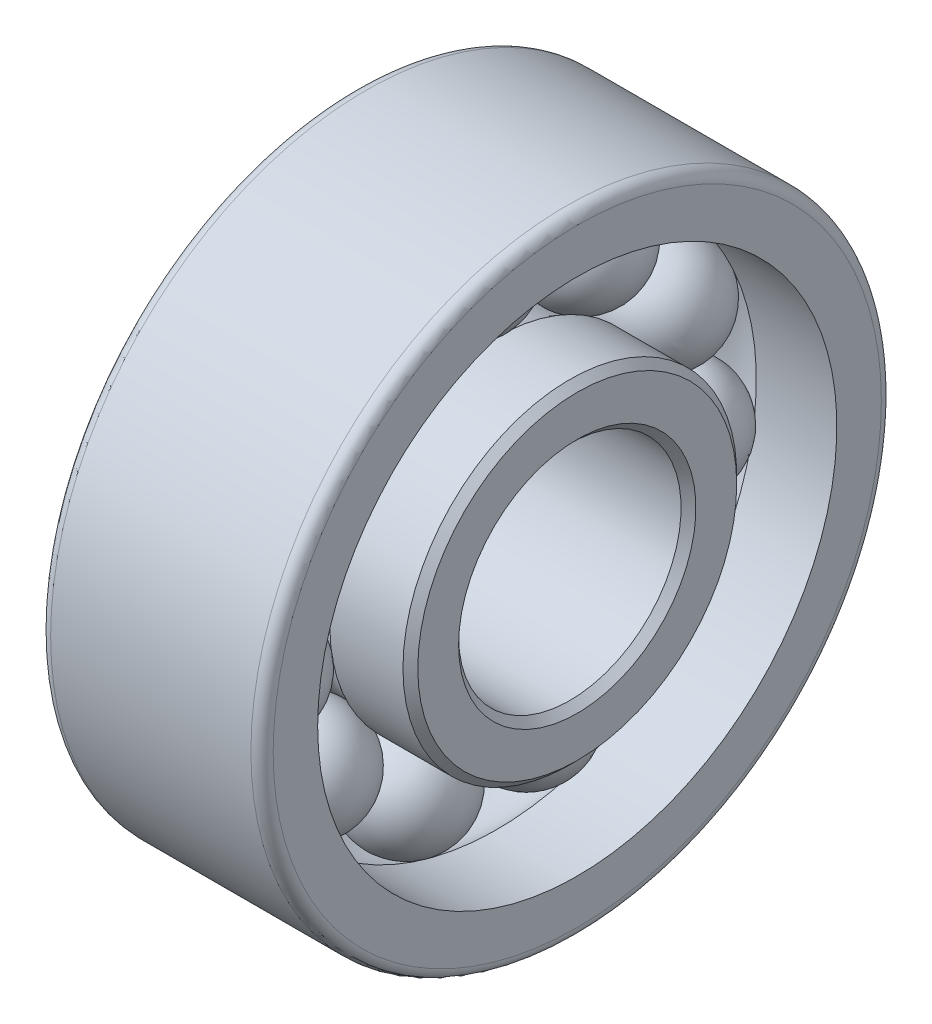
ISO-10303-21;
HEADER;
FILE_DESCRIPTION(('STEP AP214'),'2;1');
FILE_NAME('part.step','',(''),(''),'','','');
FILE_SCHEMA(('AUTOMOTIVE_DESIGN { 1 0 10303 214 1 1 1 1 }'));
ENDSEC;
DATA;
#1=APPLICATION_CONTEXT('core data for automotive mechanical design processes');
#2=APPLICATION_PROTOCOL_DEFINITION('international standard','automotive_design',2000,#1);
#3=PRODUCT_CONTEXT('',#1,'mechanical');
#4=PRODUCT('Part','Part','',(#3));
#5=PRODUCT_RELATED_PRODUCT_CATEGORY('part','',(#4));
#6=PRODUCT_DEFINITION_FORMATION('','',#4);
#7=PRODUCT_DEFINITION_CONTEXT('part definition',#1,'design');
#8=PRODUCT_DEFINITION('design','',#6,#7);
#9=PRODUCT_DEFINITION_SHAPE('','',#8);
#10=(LENGTH_UNIT() NAMED_UNIT(*) SI_UNIT(.MILLI.,.METRE.));
#11=(NAMED_UNIT(*) PLANE_ANGLE_UNIT() SI_UNIT($,.RADIAN.));
#12=(NAMED_UNIT(*) SI_UNIT($,.STERADIAN.) SOLID_ANGLE_UNIT());
#13=UNCERTAINTY_MEASURE_WITH_UNIT(LENGTH_MEASURE(1.E-05),#10,'distance_accuracy_value','');
#14=(GEOMETRIC_REPRESENTATION_CONTEXT(3) GLOBAL_UNCERTAINTY_ASSIGNED_CONTEXT((#13)) GLOBAL_UNIT_ASSIGNED_CONTEXT((#10,
#11,#12)) REPRESENTATION_CONTEXT('',''));
#15=CARTESIAN_POINT('',(0.,0.,0.));
#16=DIRECTION('',(0.,0.,1.));
#17=DIRECTION('',(1.,0.,0.));
#18=AXIS2_PLACEMENT_3D('',#15,#16,#17);
#19=CARTESIAN_POINT('',(3.,1.83720781377933,3.10868470036962));
#20=DIRECTION('',(0.,0.841253532831188,0.540640817455586));
#21=DIRECTION('',(1.,0.,0.));
#22=AXIS2_PLACEMENT_3D('',#19,#20,#21);
#23=SPHERICAL_SURFACE('',#22,1.5);
#24=CARTESIAN_POINT('',(3.,3.09908811302612,3.919645926553));
#25=VERTEX_POINT('',#24);
#26=VERTEX_LOOP('',#25);
#27=FACE_BOUND('',#26,.T.);
#28=ADVANCED_FACE('F48',(#27),#23,.T.);
#29=CLOSED_SHELL('',(#28));
#30=MANIFOLD_SOLID_BREP('B2',#29);
#31=CARTESIAN_POINT('',(3.,-0.611363675239089,5.23038397328845));
#32=DIRECTION('',(0.,0.415415013001897,0.909631995354513));
#33=DIRECTION('',(1.,0.,0.));
#34=AXIS2_PLACEMENT_3D('',#31,#32,#33);
#35=SPHERICAL_SURFACE('',#34,1.5);
#36=CARTESIAN_POINT('',(3.,0.0117588442637567,6.59483196632022));
#37=VERTEX_POINT('',#36);
#38=VERTEX_LOOP('',#37);
#39=FACE_BOUND('',#38,.T.);
#40=ADVANCED_FACE('F71',(#39),#35,.T.);
#41=CLOSED_SHELL('',(#40));
#42=MANIFOLD_SOLID_BREP('B6',#41);
#43=CARTESIAN_POINT('',(3.,-3.81831032007133,5.69147329081537));
#44=DIRECTION('',(0.,-0.142314838273275,0.989821441880934));
#45=DIRECTION('',(1.,0.,0.));
#46=AXIS2_PLACEMENT_3D('',#43,#44,#45);
#47=SPHERICAL_SURFACE('',#46,1.5);
#48=CARTESIAN_POINT('',(3.,-4.03178257748124,7.17620545363678));
#49=VERTEX_POINT('',#48);
#50=VERTEX_LOOP('',#49);
#51=FACE_BOUND('',#50,.T.);
#52=ADVANCED_FACE('F94',(#51),#47,.T.);
#53=CLOSED_SHELL('',(#52));
#54=MANIFOLD_SOLID_BREP('B44',#53);
#55=CARTESIAN_POINT('',(3.,-6.76544922018535,4.34556005253702));
#56=DIRECTION('',(0.,-0.654860733945278,0.755749574354264));
#57=DIRECTION('',(1.,0.,0.));
#58=AXIS2_PLACEMENT_3D('',#55,#56,#57);
#59=SPHERICAL_SURFACE('',#58,1.5);
#60=CARTESIAN_POINT('',(3.,-7.74774032110327,5.47918441406842));
#61=VERTEX_POINT('',#60);
#62=VERTEX_LOOP('',#61);
#63=FACE_BOUND('',#62,.T.);
#64=ADVANCED_FACE('F117',(#63),#59,.T.);
#65=CLOSED_SHELL('',(#64));
#66=MANIFOLD_SOLID_BREP('B67',#65);
#67=CARTESIAN_POINT('',(3.,-8.51708459828335,1.61996220183826));
#68=DIRECTION('',(0.,-0.959492973614495,0.281732556841437));
#69=DIRECTION('',(1.,0.,0.));
#70=AXIS2_PLACEMENT_3D('',#67,#68,#69);
#71=SPHERICAL_SURFACE('',#70,1.5);
#72=CARTESIAN_POINT('',(3.,-9.95632405870509,2.04256103710042));
#73=VERTEX_POINT('',#72);
#74=VERTEX_LOOP('',#73);
#75=FACE_BOUND('',#74,.T.);
#76=ADVANCED_FACE('F140',(#75),#71,.T.);
#77=CLOSED_SHELL('',(#76));
#78=MANIFOLD_SOLID_BREP('B90',#77);
#79=CARTESIAN_POINT('',(3.,-8.51708459828337,-1.61996220183818));
#80=DIRECTION('',(0.,-0.959492973614499,-0.281732556841423));
#81=DIRECTION('',(1.,0.,0.));
#82=AXIS2_PLACEMENT_3D('',#79,#80,#81);
#83=SPHERICAL_SURFACE('',#82,1.5);
#84=CARTESIAN_POINT('',(3.,-9.95632405870512,-2.04256103710032));
#85=VERTEX_POINT('',#84);
#86=VERTEX_LOOP('',#85);
#87=FACE_BOUND('',#86,.T.);
#88=ADVANCED_FACE('F163',(#87),#83,.T.);
#89=CLOSED_SHELL('',(#88));
#90=MANIFOLD_SOLID_BREP('B113',#89);
#91=CARTESIAN_POINT('',(3.,-6.76544922018541,-4.34556005253697));
#92=DIRECTION('',(0.,-0.654860733945289,-0.755749574354255));
#93=DIRECTION('',(1.,0.,0.));
#94=AXIS2_PLACEMENT_3D('',#91,#92,#93);
#95=SPHERICAL_SURFACE('',#94,1.5);
#96=CARTESIAN_POINT('',(3.,-7.74774032110335,-5.47918441406835));
#97=VERTEX_POINT('',#96);
#98=VERTEX_LOOP('',#97);
#99=FACE_BOUND('',#98,.T.);
#100=ADVANCED_FACE('F186',(#99),#95,.T.);
#101=CLOSED_SHELL('',(#100));
#102=MANIFOLD_SOLID_BREP('B136',#101);
#103=CARTESIAN_POINT('',(3.,-3.81831032007141,-5.69147329081536));
#104=DIRECTION('',(0.,-0.142314838273289,-0.989821441880932));
#105=DIRECTION('',(1.,0.,0.));
#106=AXIS2_PLACEMENT_3D('',#103,#104,#105);
#107=SPHERICAL_SURFACE('',#106,1.5);
#108=CARTESIAN_POINT('',(3.,-4.03178257748135,-7.17620545363676));
#109=VERTEX_POINT('',#108);
#110=VERTEX_LOOP('',#109);
#111=FACE_BOUND('',#110,.T.);
#112=ADVANCED_FACE('F209',(#111),#107,.T.);
#113=CLOSED_SHELL('',(#112));
#114=MANIFOLD_SOLID_BREP('B159',#113);
#115=CARTESIAN_POINT('',(3.,-0.611363675239166,-5.23038397328849));
#116=DIRECTION('',(0.,0.415415013001884,-0.909631995354519));
#117=DIRECTION('',(1.,0.,0.));
#118=AXIS2_PLACEMENT_3D('',#115,#116,#117);
#119=SPHERICAL_SURFACE('',#118,1.5);
#120=CARTESIAN_POINT('',(3.,0.0117588442636605,-6.59483196632027));
#121=VERTEX_POINT('',#120);
#122=VERTEX_LOOP('',#121);
#123=FACE_BOUND('',#122,.T.);
#124=ADVANCED_FACE('F232',(#123),#119,.T.);
#125=CLOSED_SHELL('',(#124));
#126=MANIFOLD_SOLID_BREP('B182',#125);
#127=CARTESIAN_POINT('',(3.,1.83720781377929,-3.10868470036969));
#128=DIRECTION('',(0.,0.841253532831181,-0.540640817455599));
#129=DIRECTION('',(1.,0.,0.));
#130=AXIS2_PLACEMENT_3D('',#127,#128,#129);
#131=SPHERICAL_SURFACE('',#130,1.5);
#132=CARTESIAN_POINT('',(3.,3.09908811302606,-3.91964592655309));
#133=VERTEX_POINT('',#132);
#134=VERTEX_LOOP('',#133);
#135=FACE_BOUND('',#134,.T.);
#136=ADVANCED_FACE('F255',(#135),#131,.T.);
#137=CLOSED_SHELL('',(#136));
#138=MANIFOLD_SOLID_BREP('B205',#137);
#139=CARTESIAN_POINT('',(3.,2.75,0.));
#140=DIRECTION('',(0.,1.,0.));
#141=DIRECTION('',(1.,0.,0.));
#142=AXIS2_PLACEMENT_3D('',#139,#140,#141);
#143=SPHERICAL_SURFACE('',#142,1.5);
#144=CARTESIAN_POINT('',(3.,4.25,0.));
#145=VERTEX_POINT('',#144);
#146=VERTEX_LOOP('',#145);
#147=FACE_BOUND('',#146,.T.);
#148=ADVANCED_FACE('F280',(#147),#143,.T.);
#149=CLOSED_SHELL('',(#148));
#150=MANIFOLD_SOLID_BREP('B228',#149);
#151=CARTESIAN_POINT('',(0.,4.,0.));
#152=DIRECTION('',(1.,0.,0.));
#153=DIRECTION('',(0.,0.,-1.));
#154=AXIS2_PLACEMENT_3D('',#151,#152,#153);
#155=PLANE('',#154);
#156=CARTESIAN_POINT('',(0.,-3.,0.));
#157=DIRECTION('',(1.,0.,0.));
#158=DIRECTION('',(0.,0.,-1.));
#159=AXIS2_PLACEMENT_3D('',#156,#157,#158);
#160=CIRCLE('',#159,8.2);
#161=CARTESIAN_POINT('',(0.,-3.,-8.2));
#162=VERTEX_POINT('',#161);
#163=EDGE_CURVE('E279',#162,#162,#160,.F.);
#164=ORIENTED_EDGE('',*,*,#163,.T.);
#165=EDGE_LOOP('',(#164));
#166=FACE_BOUND('',#165,.T.);
#167=CARTESIAN_POINT('',(0.,-3.,0.));
#168=DIRECTION('',(-1.,0.,0.));
#169=DIRECTION('',(0.,0.,1.));
#170=AXIS2_PLACEMENT_3D('',#167,#168,#169);
#171=CIRCLE('',#170,7.);
#172=CARTESIAN_POINT('',(0.,-3.,7.));
#173=VERTEX_POINT('',#172);
#174=EDGE_CURVE('E322',#173,#173,#171,.T.);
#175=ORIENTED_EDGE('',*,*,#174,.F.);
#176=EDGE_LOOP('',(#175));
#177=FACE_BOUND('',#176,.T.);
#178=ADVANCED_FACE('F302',(#166,#177),#155,.F.);
#179=CARTESIAN_POINT('',(-1.0669014084507,-3.,0.));
#180=DIRECTION('',(-1.,0.,0.));
#181=DIRECTION('',(0.,0.,1.));
#182=AXIS2_PLACEMENT_3D('',#179,#180,#181);
#183=CYLINDRICAL_SURFACE('',#182,7.);
#184=CARTESIAN_POINT('',(2.17084380241115,-3.,0.));
#185=DIRECTION('',(-1.,0.,0.));
#186=DIRECTION('',(0.,0.,1.));
#187=AXIS2_PLACEMENT_3D('',#184,#185,#186);
#188=CIRCLE('',#187,7.);
#189=CARTESIAN_POINT('',(2.17084380241115,-3.,7.));
#190=VERTEX_POINT('',#189);
#191=EDGE_CURVE('E325',#190,#190,#188,.T.);
#192=ORIENTED_EDGE('',*,*,#191,.F.);
#193=EDGE_LOOP('',(#192));
#194=FACE_BOUND('',#193,.T.);
#195=ORIENTED_EDGE('',*,*,#174,.T.);
#196=EDGE_LOOP('',(#195));
#197=FACE_BOUND('',#196,.T.);
#198=ADVANCED_FACE('F346',(#194,#197),#183,.F.);
#199=CARTESIAN_POINT('',(3.,-3.,0.));
#200=DIRECTION('',(-1.,0.,0.));
#201=DIRECTION('',(0.,0.,1.));
#202=AXIS2_PLACEMENT_3D('',#199,#200,#201);
#203=TOROIDAL_SURFACE('',#202,5.75,1.5);
#204=CARTESIAN_POINT('',(3.82915619758885,-3.,0.));
#205=DIRECTION('',(-1.,0.,0.));
#206=DIRECTION('',(0.,0.,1.));
#207=AXIS2_PLACEMENT_3D('',#204,#205,#206);
#208=CIRCLE('',#207,7.);
#209=CARTESIAN_POINT('',(3.82915619758885,-3.,7.));
#210=VERTEX_POINT('',#209);
#211=EDGE_CURVE('E328',#210,#210,#208,.T.);
#212=ORIENTED_EDGE('',*,*,#211,.F.);
#213=EDGE_LOOP('',(#212));
#214=FACE_BOUND('',#213,.T.);
#215=ORIENTED_EDGE('',*,*,#191,.T.);
#216=EDGE_LOOP('',(#215));
#217=FACE_BOUND('',#216,.T.);
#218=ADVANCED_FACE('F340',(#214,#217),#203,.F.);
#219=CARTESIAN_POINT('',(-1.0669014084507,-3.,0.));
#220=DIRECTION('',(-1.,0.,0.));
#221=DIRECTION('',(0.,0.,1.));
#222=AXIS2_PLACEMENT_3D('',#219,#220,#221);
#223=CYLINDRICAL_SURFACE('',#222,7.);
#224=CARTESIAN_POINT('',(6.,-3.,0.));
#225=DIRECTION('',(-1.,0.,0.));
#226=DIRECTION('',(0.,0.,1.));
#227=AXIS2_PLACEMENT_3D('',#224,#225,#226);
#228=CIRCLE('',#227,7.);
#229=CARTESIAN_POINT('',(6.,-3.,7.));
#230=VERTEX_POINT('',#229);
#231=EDGE_CURVE('E331',#230,#230,#228,.T.);
#232=ORIENTED_EDGE('',*,*,#231,.F.);
#233=EDGE_LOOP('',(#232));
#234=FACE_BOUND('',#233,.T.);
#235=ORIENTED_EDGE('',*,*,#211,.T.);
#236=EDGE_LOOP('',(#235));
#237=FACE_BOUND('',#236,.T.);
#238=ADVANCED_FACE('F337',(#234,#237),#223,.F.);
#239=CARTESIAN_POINT('',(6.,4.,0.));
#240=DIRECTION('',(-1.,0.,0.));
#241=DIRECTION('',(0.,0.,1.));
#242=AXIS2_PLACEMENT_3D('',#239,#240,#241);
#243=PLANE('',#242);
#244=CARTESIAN_POINT('',(6.,-3.,0.));
#245=DIRECTION('',(-1.,0.,0.));
#246=DIRECTION('',(0.,0.,1.));
#247=AXIS2_PLACEMENT_3D('',#244,#245,#246);
#248=CIRCLE('',#247,8.2);
#249=CARTESIAN_POINT('',(6.,-3.,8.2));
#250=VERTEX_POINT('',#249);
#251=EDGE_CURVE('E309',#250,#250,#248,.F.);
#252=ORIENTED_EDGE('',*,*,#251,.T.);
#253=EDGE_LOOP('',(#252));
#254=FACE_BOUND('',#253,.T.);
#255=ORIENTED_EDGE('',*,*,#231,.T.);
#256=EDGE_LOOP('',(#255));
#257=FACE_BOUND('',#256,.T.);
#258=ADVANCED_FACE('F335',(#254,#257),#243,.F.);
#259=CARTESIAN_POINT('',(-1.0669014084507,-3.,0.));
#260=DIRECTION('',(-1.,0.,0.));
#261=DIRECTION('',(0.,0.,1.));
#262=AXIS2_PLACEMENT_3D('',#259,#260,#261);
#263=CYLINDRICAL_SURFACE('',#262,8.5);
#264=CARTESIAN_POINT('',(5.7,-3.,0.));
#265=DIRECTION('',(-1.,0.,0.));
#266=DIRECTION('',(0.,0.,1.));
#267=AXIS2_PLACEMENT_3D('',#264,#265,#266);
#268=CIRCLE('',#267,8.5);
#269=CARTESIAN_POINT('',(5.7,-3.,8.5));
#270=VERTEX_POINT('',#269);
#271=EDGE_CURVE('E313',#270,#270,#268,.T.);
#272=ORIENTED_EDGE('',*,*,#271,.T.);
#273=EDGE_LOOP('',(#272));
#274=FACE_BOUND('',#273,.T.);
#275=CARTESIAN_POINT('',(0.3,-3.,0.));
#276=DIRECTION('',(1.,0.,0.));
#277=DIRECTION('',(0.,0.,-1.));
#278=AXIS2_PLACEMENT_3D('',#275,#276,#277);
#279=CIRCLE('',#278,8.5);
#280=CARTESIAN_POINT('',(0.3,-3.,-8.5));
#281=VERTEX_POINT('',#280);
#282=EDGE_CURVE('E317',#281,#281,#279,.T.);
#283=ORIENTED_EDGE('',*,*,#282,.T.);
#284=EDGE_LOOP('',(#283));
#285=FACE_BOUND('',#284,.T.);
#286=ADVANCED_FACE('F361',(#274,#285),#263,.T.);
#287=CARTESIAN_POINT('',(5.7,-3.,0.));
#288=DIRECTION('',(-1.,0.,0.));
#289=DIRECTION('',(0.,0.,1.));
#290=AXIS2_PLACEMENT_3D('',#287,#288,#289);
#291=TOROIDAL_SURFACE('',#290,8.2,0.3);
#292=ORIENTED_EDGE('',*,*,#251,.F.);
#293=EDGE_LOOP('',(#292));
#294=FACE_BOUND('',#293,.T.);
#295=ORIENTED_EDGE('',*,*,#271,.F.);
#296=EDGE_LOOP('',(#295));
#297=FACE_BOUND('',#296,.T.);
#298=ADVANCED_FACE('F359',(#294,#297),#291,.T.);
#299=CARTESIAN_POINT('',(0.3,-3.,0.));
#300=DIRECTION('',(1.,0.,0.));
#301=DIRECTION('',(0.,0.,-1.));
#302=AXIS2_PLACEMENT_3D('',#299,#300,#301);
#303=TOROIDAL_SURFACE('',#302,8.2,0.3);
#304=ORIENTED_EDGE('',*,*,#282,.F.);
#305=EDGE_LOOP('',(#304));
#306=FACE_BOUND('',#305,.T.);
#307=ORIENTED_EDGE('',*,*,#163,.F.);
#308=EDGE_LOOP('',(#307));
#309=FACE_BOUND('',#308,.T.);
#310=ADVANCED_FACE('F304',(#306,#309),#303,.T.);
#311=CLOSED_SHELL('',(#178,#198,#218,#238,#258,#286,#298,#310));
#312=MANIFOLD_SOLID_BREP('B251',#311);
#313=CARTESIAN_POINT('',(0.,0.,0.));
#314=DIRECTION('',(1.,0.,0.));
#315=DIRECTION('',(0.,0.,-1.));
#316=AXIS2_PLACEMENT_3D('',#313,#314,#315);
#317=PLANE('',#316);
#318=CARTESIAN_POINT('',(0.,-3.,0.));
#319=DIRECTION('',(1.,0.,0.));
#320=DIRECTION('',(0.,0.,-1.));
#321=AXIS2_PLACEMENT_3D('',#318,#319,#320);
#322=CIRCLE('',#321,3.2);
#323=CARTESIAN_POINT('',(0.,-3.,-3.2));
#324=VERTEX_POINT('',#323);
#325=EDGE_CURVE('E460',#324,#324,#322,.T.);
#326=ORIENTED_EDGE('',*,*,#325,.T.);
#327=EDGE_LOOP('',(#326));
#328=FACE_BOUND('',#327,.T.);
#329=CARTESIAN_POINT('',(0.,-3.,0.));
#330=DIRECTION('',(1.,0.,0.));
#331=DIRECTION('',(0.,0.,-1.));
#332=AXIS2_PLACEMENT_3D('',#329,#330,#331);
#333=CIRCLE('',#332,4.3);
#334=CARTESIAN_POINT('',(0.,-3.,-4.3));
#335=VERTEX_POINT('',#334);
#336=EDGE_CURVE('E463',#335,#335,#333,.F.);
#337=ORIENTED_EDGE('',*,*,#336,.T.);
#338=EDGE_LOOP('',(#337));
#339=FACE_BOUND('',#338,.T.);
#340=ADVANCED_FACE('F440',(#328,#339),#317,.F.);
#341=CARTESIAN_POINT('',(-1.0669014084507,-3.,0.));
#342=DIRECTION('',(-1.,0.,0.));
#343=DIRECTION('',(0.,0.,1.));
#344=AXIS2_PLACEMENT_3D('',#341,#342,#343);
#345=CYLINDRICAL_SURFACE('',#344,3.);
#346=CARTESIAN_POINT('',(0.200000000000002,-3.,0.));
#347=DIRECTION('',(1.,0.,0.));
#348=DIRECTION('',(0.,0.,-1.));
#349=AXIS2_PLACEMENT_3D('',#346,#347,#348);
#350=CIRCLE('',#349,3.);
#351=CARTESIAN_POINT('',(0.200000000000002,-3.,-3.));
#352=VERTEX_POINT('',#351);
#353=EDGE_CURVE('E466',#352,#352,#350,.F.);
#354=ORIENTED_EDGE('',*,*,#353,.T.);
#355=EDGE_LOOP('',(#354));
#356=FACE_BOUND('',#355,.T.);
#357=CARTESIAN_POINT('',(5.8,-3.,0.));
#358=DIRECTION('',(-1.,0.,0.));
#359=DIRECTION('',(0.,0.,1.));
#360=AXIS2_PLACEMENT_3D('',#357,#358,#359);
#361=CIRCLE('',#360,3.);
#362=CARTESIAN_POINT('',(5.8,-3.,3.));
#363=VERTEX_POINT('',#362);
#364=EDGE_CURVE('E469',#363,#363,#361,.F.);
#365=ORIENTED_EDGE('',*,*,#364,.T.);
#366=EDGE_LOOP('',(#365));
#367=FACE_BOUND('',#366,.T.);
#368=ADVANCED_FACE('F494',(#356,#367),#345,.F.);
#369=CARTESIAN_POINT('',(6.,0.,0.));
#370=DIRECTION('',(-1.,0.,0.));
#371=DIRECTION('',(0.,0.,1.));
#372=AXIS2_PLACEMENT_3D('',#369,#370,#371);
#373=PLANE('',#372);
#374=CARTESIAN_POINT('',(6.,-3.,0.));
#375=DIRECTION('',(-1.,0.,0.));
#376=DIRECTION('',(0.,0.,1.));
#377=AXIS2_PLACEMENT_3D('',#374,#375,#376);
#378=CIRCLE('',#377,3.2);
#379=CARTESIAN_POINT('',(6.,-3.,3.2));
#380=VERTEX_POINT('',#379);
#381=EDGE_CURVE('E451',#380,#380,#378,.T.);
#382=ORIENTED_EDGE('',*,*,#381,.T.);
#383=EDGE_LOOP('',(#382));
#384=FACE_BOUND('',#383,.T.);
#385=CARTESIAN_POINT('',(6.,-3.,0.));
#386=DIRECTION('',(-1.,0.,0.));
#387=DIRECTION('',(0.,0.,1.));
#388=AXIS2_PLACEMENT_3D('',#385,#386,#387);
#389=CIRCLE('',#388,4.3);
#390=CARTESIAN_POINT('',(6.,-3.,4.3));
#391=VERTEX_POINT('',#390);
#392=EDGE_CURVE('E455',#391,#391,#389,.F.);
#393=ORIENTED_EDGE('',*,*,#392,.T.);
#394=EDGE_LOOP('',(#393));
#395=FACE_BOUND('',#394,.T.);
#396=ADVANCED_FACE('F489',(#384,#395),#373,.F.);
#397=CARTESIAN_POINT('',(-1.0669014084507,-3.,0.));
#398=DIRECTION('',(-1.,0.,0.));
#399=DIRECTION('',(0.,0.,1.));
#400=AXIS2_PLACEMENT_3D('',#397,#398,#399);
#401=CYLINDRICAL_SURFACE('',#400,4.5);
#402=CARTESIAN_POINT('',(5.8,-3.,0.));
#403=DIRECTION('',(-1.,0.,0.));
#404=DIRECTION('',(0.,0.,1.));
#405=AXIS2_PLACEMENT_3D('',#402,#403,#404);
#406=CIRCLE('',#405,4.5);
#407=CARTESIAN_POINT('',(5.8,-3.,4.5));
#408=VERTEX_POINT('',#407);
#409=EDGE_CURVE('E447',#408,#408,#406,.T.);
#410=ORIENTED_EDGE('',*,*,#409,.T.);
#411=EDGE_LOOP('',(#410));
#412=FACE_BOUND('',#411,.T.);
#413=CARTESIAN_POINT('',(3.82915619758885,-3.,0.));
#414=DIRECTION('',(-1.,0.,0.));
#415=DIRECTION('',(0.,0.,1.));
#416=AXIS2_PLACEMENT_3D('',#413,#414,#415);
#417=CIRCLE('',#416,4.5);
#418=CARTESIAN_POINT('',(3.82915619758885,-3.,4.5));
#419=VERTEX_POINT('',#418);
#420=EDGE_CURVE('E472',#419,#419,#417,.T.);
#421=ORIENTED_EDGE('',*,*,#420,.F.);
#422=EDGE_LOOP('',(#421));
#423=FACE_BOUND('',#422,.T.);
#424=ADVANCED_FACE('F484',(#412,#423),#401,.T.);
#425=CARTESIAN_POINT('',(3.,-3.,0.));
#426=DIRECTION('',(-1.,0.,0.));
#427=DIRECTION('',(0.,0.,1.));
#428=AXIS2_PLACEMENT_3D('',#425,#426,#427);
#429=TOROIDAL_SURFACE('',#428,5.75,1.5);
#430=CARTESIAN_POINT('',(2.17084380241115,-3.,0.));
#431=DIRECTION('',(-1.,0.,0.));
#432=DIRECTION('',(0.,0.,1.));
#433=AXIS2_PLACEMENT_3D('',#430,#431,#432);
#434=CIRCLE('',#433,4.5);
#435=CARTESIAN_POINT('',(2.17084380241115,-3.,4.5));
#436=VERTEX_POINT('',#435);
#437=EDGE_CURVE('E475',#436,#436,#434,.T.);
#438=ORIENTED_EDGE('',*,*,#437,.F.);
#439=EDGE_LOOP('',(#438));
#440=FACE_BOUND('',#439,.T.);
#441=ORIENTED_EDGE('',*,*,#420,.T.);
#442=EDGE_LOOP('',(#441));
#443=FACE_BOUND('',#442,.T.);
#444=ADVANCED_FACE('F481',(#440,#443),#429,.F.);
#445=CARTESIAN_POINT('',(-1.0669014084507,-3.,0.));
#446=DIRECTION('',(-1.,0.,0.));
#447=DIRECTION('',(0.,0.,1.));
#448=AXIS2_PLACEMENT_3D('',#445,#446,#447);
#449=CYLINDRICAL_SURFACE('',#448,4.5);
#450=CARTESIAN_POINT('',(0.199999999999999,-3.,0.));
#451=DIRECTION('',(1.,0.,0.));
#452=DIRECTION('',(0.,0.,-1.));
#453=AXIS2_PLACEMENT_3D('',#450,#451,#452);
#454=CIRCLE('',#453,4.5);
#455=CARTESIAN_POINT('',(0.199999999999999,-3.,-4.5));
#456=VERTEX_POINT('',#455);
#457=EDGE_CURVE('E301',#456,#456,#454,.T.);
#458=ORIENTED_EDGE('',*,*,#457,.T.);
#459=EDGE_LOOP('',(#458));
#460=FACE_BOUND('',#459,.T.);
#461=ORIENTED_EDGE('',*,*,#437,.T.);
#462=EDGE_LOOP('',(#461));
#463=FACE_BOUND('',#462,.T.);
#464=ADVANCED_FACE('F479',(#460,#463),#449,.T.);
#465=CARTESIAN_POINT('',(0.200000000000002,-3.,0.));
#466=DIRECTION('',(-1.,0.,0.));
#467=DIRECTION('',(0.,0.,1.));
#468=AXIS2_PLACEMENT_3D('',#465,#466,#467);
#469=CONICAL_SURFACE('',#468,3.,0.785398163397448);
#470=ORIENTED_EDGE('',*,*,#325,.F.);
#471=EDGE_LOOP('',(#470));
#472=FACE_BOUND('',#471,.T.);
#473=ORIENTED_EDGE('',*,*,#353,.F.);
#474=EDGE_LOOP('',(#473));
#475=FACE_BOUND('',#474,.T.);
#476=ADVANCED_FACE('F507',(#472,#475),#469,.F.);
#477=CARTESIAN_POINT('',(6.,-3.,0.));
#478=DIRECTION('',(1.,0.,0.));
#479=DIRECTION('',(0.,0.,-1.));
#480=AXIS2_PLACEMENT_3D('',#477,#478,#479);
#481=CONICAL_SURFACE('',#480,3.2,0.785398163397448);
#482=ORIENTED_EDGE('',*,*,#364,.F.);
#483=EDGE_LOOP('',(#482));
#484=FACE_BOUND('',#483,.T.);
#485=ORIENTED_EDGE('',*,*,#381,.F.);
#486=EDGE_LOOP('',(#485));
#487=FACE_BOUND('',#486,.T.);
#488=ADVANCED_FACE('F510',(#484,#487),#481,.F.);
#489=CARTESIAN_POINT('',(5.8,-3.,0.));
#490=DIRECTION('',(-1.,0.,0.));
#491=DIRECTION('',(0.,0.,1.));
#492=AXIS2_PLACEMENT_3D('',#489,#490,#491);
#493=CONICAL_SURFACE('',#492,4.5,0.785398163397446);
#494=ORIENTED_EDGE('',*,*,#392,.F.);
#495=EDGE_LOOP('',(#494));
#496=FACE_BOUND('',#495,.T.);
#497=ORIENTED_EDGE('',*,*,#409,.F.);
#498=EDGE_LOOP('',(#497));
#499=FACE_BOUND('',#498,.T.);
#500=ADVANCED_FACE('F513',(#496,#499),#493,.T.);
#501=CARTESIAN_POINT('',(0.,-3.,0.));
#502=DIRECTION('',(1.,0.,0.));
#503=DIRECTION('',(0.,0.,-1.));
#504=AXIS2_PLACEMENT_3D('',#501,#502,#503);
#505=CONICAL_SURFACE('',#504,4.3,0.785398163397448);
#506=ORIENTED_EDGE('',*,*,#457,.F.);
#507=EDGE_LOOP('',(#506));
#508=FACE_BOUND('',#507,.T.);
#509=ORIENTED_EDGE('',*,*,#336,.F.);
#510=EDGE_LOOP('',(#509));
#511=FACE_BOUND('',#510,.T.);
#512=ADVANCED_FACE('F442',(#508,#511),#505,.T.);
#513=CLOSED_SHELL('',(#340,#368,#396,#424,#444,#464,#476,#488,#500,#512));
#514=MANIFOLD_SOLID_BREP('B274',#513);
#515=ADVANCED_BREP_SHAPE_REPRESENTATION('',(#18,#30,#42,#54,#66,#78,#90,#102,#114,#126,#138,
#150,#312,#514),#14);
#516=SHAPE_DEFINITION_REPRESENTATION(#9,#515);
ENDSEC;
END-ISO-10303-21;
